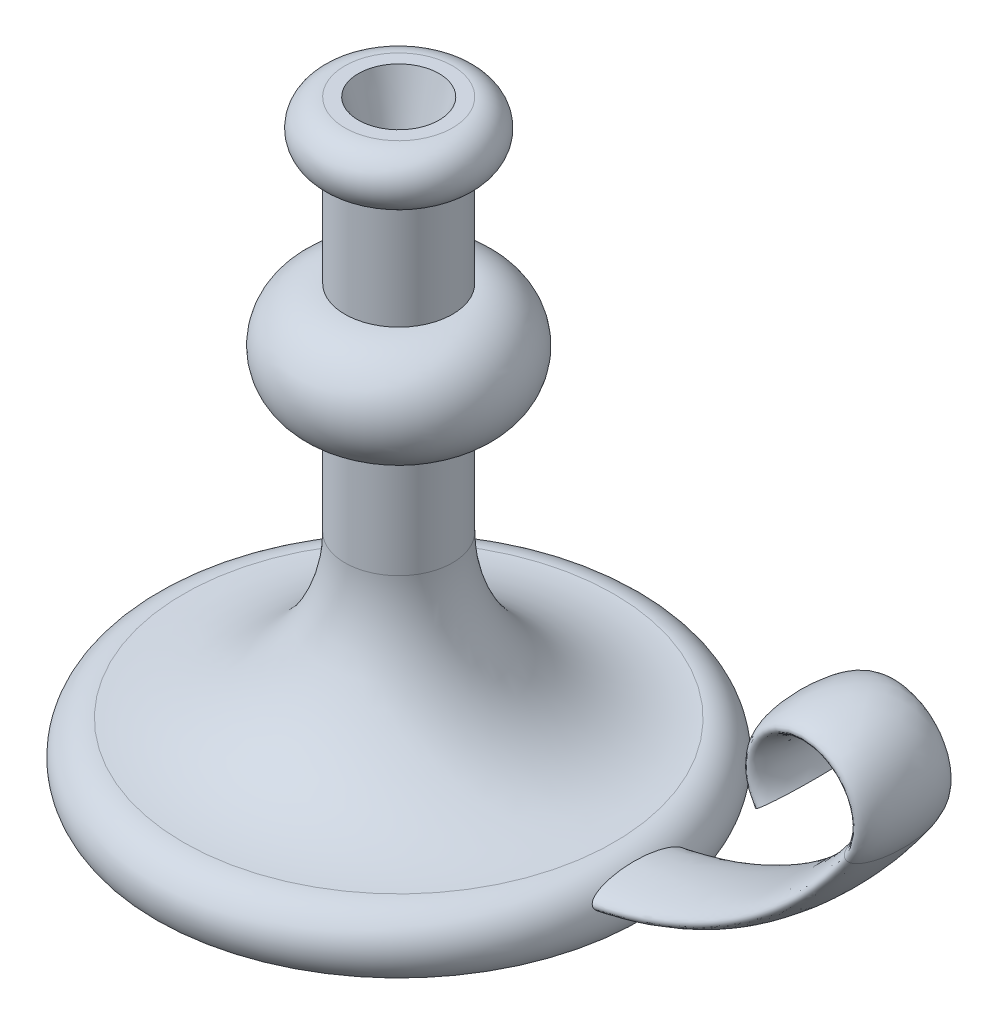
ISO-10303-21;
HEADER;
FILE_DESCRIPTION(('STEP AP214'),'2;1');
FILE_NAME('part.step','',(''),(''),'','','');
FILE_SCHEMA(('AUTOMOTIVE_DESIGN { 1 0 10303 214 1 1 1 1 }'));
ENDSEC;
DATA;
#1=APPLICATION_CONTEXT('core data for automotive mechanical design processes');
#2=APPLICATION_PROTOCOL_DEFINITION('international standard','automotive_design',2000,#1);
#3=PRODUCT_CONTEXT('',#1,'mechanical');
#4=PRODUCT('Part','Part','',(#3));
#5=PRODUCT_RELATED_PRODUCT_CATEGORY('part','',(#4));
#6=PRODUCT_DEFINITION_FORMATION('','',#4);
#7=PRODUCT_DEFINITION_CONTEXT('part definition',#1,'design');
#8=PRODUCT_DEFINITION('design','',#6,#7);
#9=PRODUCT_DEFINITION_SHAPE('','',#8);
#10=(LENGTH_UNIT() NAMED_UNIT(*) SI_UNIT(.MILLI.,.METRE.));
#11=(NAMED_UNIT(*) PLANE_ANGLE_UNIT() SI_UNIT($,.RADIAN.));
#12=(NAMED_UNIT(*) SI_UNIT($,.STERADIAN.) SOLID_ANGLE_UNIT());
#13=UNCERTAINTY_MEASURE_WITH_UNIT(LENGTH_MEASURE(1.E-05),#10,'distance_accuracy_value','');
#14=(GEOMETRIC_REPRESENTATION_CONTEXT(3) GLOBAL_UNCERTAINTY_ASSIGNED_CONTEXT((#13)) GLOBAL_UNIT_ASSIGNED_CONTEXT((#10,
#11,#12)) REPRESENTATION_CONTEXT('',''));
#15=CARTESIAN_POINT('',(0.,0.,0.));
#16=DIRECTION('',(0.,0.,1.));
#17=DIRECTION('',(1.,0.,0.));
#18=AXIS2_PLACEMENT_3D('',#15,#16,#17);
#19=CARTESIAN_POINT('',(0.,0.,0.));
#20=DIRECTION('',(0.,-1.,0.));
#21=DIRECTION('',(0.,0.,-1.));
#22=AXIS2_PLACEMENT_3D('',#19,#20,#21);
#23=PLANE('',#22);
#24=CARTESIAN_POINT('',(0.,0.,0.));
#25=DIRECTION('',(0.,-1.,0.));
#26=DIRECTION('',(0.,0.,-1.));
#27=AXIS2_PLACEMENT_3D('',#24,#25,#26);
#28=CIRCLE('',#27,90.);
#29=CARTESIAN_POINT('',(0.,0.,-90.));
#30=VERTEX_POINT('',#29);
#31=EDGE_CURVE('E69',#30,#30,#28,.T.);
#32=ORIENTED_EDGE('',*,*,#31,.T.);
#33=EDGE_LOOP('',(#32));
#34=FACE_BOUND('',#33,.T.);
#35=ADVANCED_FACE('F36',(#34),#23,.T.);
#36=CARTESIAN_POINT('',(0.,220.,0.));
#37=DIRECTION('',(0.,1.,0.));
#38=DIRECTION('',(0.,0.,1.));
#39=AXIS2_PLACEMENT_3D('',#36,#37,#38);
#40=PLANE('',#39);
#41=CARTESIAN_POINT('',(0.,220.,0.));
#42=DIRECTION('',(0.,1.,0.));
#43=DIRECTION('',(0.,0.,1.));
#44=AXIS2_PLACEMENT_3D('',#41,#42,#43);
#45=CIRCLE('',#44,15.);
#46=CARTESIAN_POINT('',(0.,220.,15.));
#47=VERTEX_POINT('',#46);
#48=EDGE_CURVE('E81',#47,#47,#45,.T.);
#49=ORIENTED_EDGE('',*,*,#48,.F.);
#50=EDGE_LOOP('',(#49));
#51=FACE_BOUND('',#50,.T.);
#52=CARTESIAN_POINT('',(0.,220.,0.));
#53=DIRECTION('',(0.,-1.,0.));
#54=DIRECTION('',(0.,0.,-1.));
#55=AXIS2_PLACEMENT_3D('',#52,#53,#54);
#56=CIRCLE('',#55,20.);
#57=CARTESIAN_POINT('',(0.,220.,-20.));
#58=VERTEX_POINT('',#57);
#59=EDGE_CURVE('E47',#58,#58,#56,.T.);
#60=ORIENTED_EDGE('',*,*,#59,.F.);
#61=EDGE_LOOP('',(#60));
#62=FACE_BOUND('',#61,.T.);
#63=ADVANCED_FACE('F87',(#51,#62),#40,.T.);
#64=CARTESIAN_POINT('',(0.,210.,0.));
#65=DIRECTION('',(0.,-1.,0.));
#66=DIRECTION('',(0.,0.,-1.));
#67=AXIS2_PLACEMENT_3D('',#64,#65,#66);
#68=TOROIDAL_SURFACE('',#67,20.,10.);
#69=ORIENTED_EDGE('',*,*,#59,.T.);
#70=EDGE_LOOP('',(#69));
#71=FACE_BOUND('',#70,.T.);
#72=CARTESIAN_POINT('',(0.,200.,0.));
#73=DIRECTION('',(0.,-1.,0.));
#74=DIRECTION('',(0.,0.,-1.));
#75=AXIS2_PLACEMENT_3D('',#72,#73,#74);
#76=CIRCLE('',#75,20.);
#77=CARTESIAN_POINT('',(0.,200.,-20.));
#78=VERTEX_POINT('',#77);
#79=EDGE_CURVE('E51',#78,#78,#76,.T.);
#80=ORIENTED_EDGE('',*,*,#79,.F.);
#81=EDGE_LOOP('',(#80));
#82=FACE_BOUND('',#81,.T.);
#83=ADVANCED_FACE('F90',(#71,#82),#68,.T.);
#84=CARTESIAN_POINT('',(0.,0.,0.));
#85=DIRECTION('',(0.,-1.,0.));
#86=DIRECTION('',(0.,0.,-1.));
#87=AXIS2_PLACEMENT_3D('',#84,#85,#86);
#88=CYLINDRICAL_SURFACE('',#87,20.);
#89=ORIENTED_EDGE('',*,*,#79,.T.);
#90=EDGE_LOOP('',(#89));
#91=FACE_BOUND('',#90,.T.);
#92=CARTESIAN_POINT('',(0.,160.,0.));
#93=DIRECTION('',(0.,-1.,0.));
#94=DIRECTION('',(0.,0.,-1.));
#95=AXIS2_PLACEMENT_3D('',#92,#93,#94);
#96=CIRCLE('',#95,20.);
#97=CARTESIAN_POINT('',(0.,160.,-20.));
#98=VERTEX_POINT('',#97);
#99=EDGE_CURVE('E55',#98,#98,#96,.T.);
#100=ORIENTED_EDGE('',*,*,#99,.F.);
#101=EDGE_LOOP('',(#100));
#102=FACE_BOUND('',#101,.T.);
#103=ADVANCED_FACE('F95',(#91,#102),#88,.T.);
#104=CARTESIAN_POINT('',(0.,140.,0.));
#105=DIRECTION('',(0.,-1.,0.));
#106=DIRECTION('',(0.,0.,-1.));
#107=AXIS2_PLACEMENT_3D('',#104,#105,#106);
#108=DEGENERATE_TOROIDAL_SURFACE('',#107,20.,20.,.T.);
#109=ORIENTED_EDGE('',*,*,#99,.T.);
#110=EDGE_LOOP('',(#109));
#111=FACE_BOUND('',#110,.T.);
#112=CARTESIAN_POINT('',(0.,120.,0.));
#113=DIRECTION('',(0.,-1.,0.));
#114=DIRECTION('',(0.,0.,-1.));
#115=AXIS2_PLACEMENT_3D('',#112,#113,#114);
#116=CIRCLE('',#115,20.);
#117=CARTESIAN_POINT('',(0.,120.,-20.));
#118=VERTEX_POINT('',#117);
#119=EDGE_CURVE('E60',#118,#118,#116,.T.);
#120=ORIENTED_EDGE('',*,*,#119,.F.);
#121=EDGE_LOOP('',(#120));
#122=FACE_BOUND('',#121,.T.);
#123=ADVANCED_FACE('F101',(#111,#122),#108,.T.);
#124=CARTESIAN_POINT('',(0.,0.,0.));
#125=DIRECTION('',(0.,-1.,0.));
#126=DIRECTION('',(0.,0.,-1.));
#127=AXIS2_PLACEMENT_3D('',#124,#125,#126);
#128=CYLINDRICAL_SURFACE('',#127,20.);
#129=ORIENTED_EDGE('',*,*,#119,.T.);
#130=EDGE_LOOP('',(#129));
#131=FACE_BOUND('',#130,.T.);
#132=CARTESIAN_POINT('',(0.,80.,0.));
#133=DIRECTION('',(0.,-1.,0.));
#134=DIRECTION('',(0.,0.,-1.));
#135=AXIS2_PLACEMENT_3D('',#132,#133,#134);
#136=CIRCLE('',#135,20.);
#137=CARTESIAN_POINT('',(0.,80.,-20.));
#138=VERTEX_POINT('',#137);
#139=EDGE_CURVE('E63',#138,#138,#136,.T.);
#140=ORIENTED_EDGE('',*,*,#139,.F.);
#141=EDGE_LOOP('',(#140));
#142=FACE_BOUND('',#141,.T.);
#143=ADVANCED_FACE('F105',(#131,#142),#128,.T.);
#144=CARTESIAN_POINT('',(0.,80.,0.));
#145=DIRECTION('',(0.,-1.,0.));
#146=DIRECTION('',(0.,0.,-1.));
#147=AXIS2_PLACEMENT_3D('',#144,#145,#146);
#148=TOROIDAL_SURFACE('',#147,80.,60.);
#149=ORIENTED_EDGE('',*,*,#139,.T.);
#150=EDGE_LOOP('',(#149));
#151=FACE_BOUND('',#150,.T.);
#152=CARTESIAN_POINT('',(0.,20.,0.));
#153=DIRECTION('',(0.,-1.,0.));
#154=DIRECTION('',(0.,0.,-1.));
#155=AXIS2_PLACEMENT_3D('',#152,#153,#154);
#156=CIRCLE('',#155,79.9999999999999);
#157=CARTESIAN_POINT('',(0.,20.,-79.9999999999999));
#158=VERTEX_POINT('',#157);
#159=EDGE_CURVE('E66',#158,#158,#156,.T.);
#160=ORIENTED_EDGE('',*,*,#159,.F.);
#161=EDGE_LOOP('',(#160));
#162=FACE_BOUND('',#161,.T.);
#163=ADVANCED_FACE('F109',(#151,#162),#148,.F.);
#164=CARTESIAN_POINT('',(0.,7.49999999999998,0.));
#165=DIRECTION('',(0.,-1.,0.));
#166=DIRECTION('',(0.,0.,-1.));
#167=AXIS2_PLACEMENT_3D('',#164,#165,#166);
#168=TOROIDAL_SURFACE('',#167,80.,12.5);
#169=CARTESIAN_POINT('',(89.5597422043341,12.9414346567555,-17.5));
#170=CARTESIAN_POINT('',(89.5390618403561,12.9834100865229,-17.4999996776707));
#171=CARTESIAN_POINT('',(89.5184817634659,13.0254349004937,-17.4978446678338));
#172=CARTESIAN_POINT('',(89.4776811982743,13.1092324497794,-17.4892861575811));
#173=CARTESIAN_POINT('',(89.457460843071,13.1510050881611,-17.4828811168849));
#174=CARTESIAN_POINT('',(89.3975402811209,13.2754779151414,-17.4575154450276));
#175=CARTESIAN_POINT('',(89.3585808220613,13.357332519418,-17.4324042670614));
#176=CARTESIAN_POINT('',(89.2734407804368,13.5379179993389,-17.3597430943198));
#177=CARTESIAN_POINT('',(89.2281116968574,13.6353152430682,-17.3079906529225));
#178=CARTESIAN_POINT('',(89.1421567137609,13.8217570109409,-17.1881654215547));
#179=CARTESIAN_POINT('',(89.10154096816,13.9107834263932,-17.1200583326704));
#180=CARTESIAN_POINT('',(89.0298799325304,14.0690063055582,-16.9825317839868));
#181=CARTESIAN_POINT('',(88.9982856031081,14.1392491335226,-16.9145677994464));
#182=CARTESIAN_POINT('',(88.9378435588022,14.2742914925202,-16.7722502997375));
#183=CARTESIAN_POINT('',(88.9089980734781,14.3390866000317,-16.6978916893925));
#184=CARTESIAN_POINT('',(88.8536099995593,14.4639626152392,-16.5442177801531));
#185=CARTESIAN_POINT('',(88.8270733532936,14.5240313225779,-16.4648905452804));
#186=CARTESIAN_POINT('',(88.7760376587063,14.6398576639347,-16.3025863942461));
#187=CARTESIAN_POINT('',(88.7515379613228,14.6956166708123,-16.2196106536441));
#188=CARTESIAN_POINT('',(88.7047328205489,14.8023169553036,-16.052427362784));
#189=CARTESIAN_POINT('',(88.6823939519366,14.8533308765833,-15.9682752160745));
#190=CARTESIAN_POINT('',(88.639155365759,14.9521540950118,-15.797741621076));
#191=CARTESIAN_POINT('',(88.6182558899721,14.9999628537458,-15.711359801597));
#192=CARTESIAN_POINT('',(88.5573681790008,15.1392585624723,-15.4492483073626));
#193=CARTESIAN_POINT('',(88.5192579811327,15.2264609786255,-15.2707999543232));
#194=CARTESIAN_POINT('',(88.4468979005836,15.3916731276291,-14.9088289385944));
#195=CARTESIAN_POINT('',(88.4126513155026,15.4696750103546,-14.7253021052891));
#196=CARTESIAN_POINT('',(88.3471391595039,15.6182965032923,-14.3538259785736));
#197=CARTESIAN_POINT('',(88.3158872528145,15.6888824046965,-14.1658608782527));
#198=CARTESIAN_POINT('',(88.2560127035516,15.8233792512431,-13.787400391854));
#199=CARTESIAN_POINT('',(88.2273872233002,15.8872974109117,-13.5969079973403));
#200=CARTESIAN_POINT('',(88.1723348827448,16.0094159388249,-13.2138496737791));
#201=CARTESIAN_POINT('',(88.1459074726896,16.06761773743,-13.0212842768931));
#202=CARTESIAN_POINT('',(88.0884248304702,16.1932687928886,-12.5849658119248));
#203=CARTESIAN_POINT('',(88.0579162002184,16.2592725226906,-12.3407253521735));
#204=CARTESIAN_POINT('',(87.9994625659013,16.3844358500305,-11.8501803460782));
#205=CARTESIAN_POINT('',(87.9715178234088,16.4435947494061,-11.6038755919223));
#206=CARTESIAN_POINT('',(87.9178897421857,16.5558889779776,-11.109529987048));
#207=CARTESIAN_POINT('',(87.8922075114269,16.6090213595568,-10.86148834924));
#208=CARTESIAN_POINT('',(87.8429155378603,16.7098546386226,-10.3640943607018));
#209=CARTESIAN_POINT('',(87.8193058942811,16.7575552760878,-10.1147419478211));
#210=CARTESIAN_POINT('',(87.7514718906047,16.8930622945828,-9.3663139664491));
#211=CARTESIAN_POINT('',(87.710111419914,16.97354616682,-8.86564202060326));
#212=CARTESIAN_POINT('',(87.6344118706353,17.1178657179368,-7.86153551840242));
#213=CARTESIAN_POINT('',(87.6000713341079,17.1817048544489,-7.35810155802579));
#214=CARTESIAN_POINT('',(87.5383679228554,17.2943697092707,-6.35225136111889));
#215=CARTESIAN_POINT('',(87.5109639050818,17.3432843238913,-5.84984753787572));
#216=CARTESIAN_POINT('',(87.4628391630611,17.4279603163538,-4.84354228831027));
#217=CARTESIAN_POINT('',(87.4421195253372,17.4637195559667,-4.33964063194106));
#218=CARTESIAN_POINT('',(87.4074386787954,17.5229738360404,-3.3308436388603));
#219=CARTESIAN_POINT('',(87.3934780874881,17.5464677559495,-2.82594821558698));
#220=CARTESIAN_POINT('',(87.3724154174235,17.5817273168609,-1.8161521338082));
#221=CARTESIAN_POINT('',(87.3653059747339,17.5935055508652,-1.31125206554538));
#222=CARTESIAN_POINT('',(87.3579750479624,17.6056484066489,-0.301318309133084));
#223=CARTESIAN_POINT('',(87.357752858235,17.6060141977103,0.203715360025915));
#224=CARTESIAN_POINT('',(87.3641963426438,17.5953454261039,1.21356726554151));
#225=CARTESIAN_POINT('',(87.3708612610896,17.5843121142069,1.71838551945491));
#226=CARTESIAN_POINT('',(87.3886163883338,17.554616306541,2.60695068649834));
#227=CARTESIAN_POINT('',(87.3982690399212,17.5384060734754,2.9908104647882));
#228=CARTESIAN_POINT('',(87.4214966880659,17.4990063104014,3.75807002785692));
#229=CARTESIAN_POINT('',(87.435071823598,17.4758165331044,4.14146979585408));
#230=CARTESIAN_POINT('',(87.4661109016121,17.4221255760208,4.90767543763189));
#231=CARTESIAN_POINT('',(87.4835755913648,17.3916229911934,5.29048118303739));
#232=CARTESIAN_POINT('',(87.5224765269599,17.3226675403927,6.05728766608015));
#233=CARTESIAN_POINT('',(87.5439339089184,17.2841722314846,6.4412835383542));
#234=CARTESIAN_POINT('',(87.5907685418077,17.1987228636429,7.20803081067535));
#235=CARTESIAN_POINT('',(87.6161451191905,17.1517702579396,7.59078241304208));
#236=CARTESIAN_POINT('',(87.6708875244928,17.0486132676473,8.35453102594092));
#237=CARTESIAN_POINT('',(87.7002509792864,16.9924143825779,8.73552894189113));
#238=CARTESIAN_POINT('',(87.7555693385741,16.8844873931685,9.40362807317323));
#239=CARTESIAN_POINT('',(87.780631862629,16.8349635590469,9.69115955865538));
#240=CARTESIAN_POINT('',(87.8333287645207,16.7293167465829,10.264824207122));
#241=CARTESIAN_POINT('',(87.8609635304671,16.6731927720485,10.550957152212));
#242=CARTESIAN_POINT('',(87.9190678138248,16.5534902310352,11.121711283161));
#243=CARTESIAN_POINT('',(87.9495404231883,16.4899035134826,11.4063304543322));
#244=CARTESIAN_POINT('',(88.0137266324375,16.3541216812727,11.9738772339474));
#245=CARTESIAN_POINT('',(88.0474477220507,16.2819065762202,12.2567992545896));
#246=CARTESIAN_POINT('',(88.1183718381952,16.1280994435204,12.8175821097586));
#247=CARTESIAN_POINT('',(88.1555499028382,16.0465737963571,13.095464192068));
#248=CARTESIAN_POINT('',(88.2343580118384,15.8719007074314,13.6468218234685));
#249=CARTESIAN_POINT('',(88.2759857295858,15.7787593350286,13.920299590218));
#250=CARTESIAN_POINT('',(88.3426568223938,15.628384040649,14.3254052817089));
#251=CARTESIAN_POINT('',(88.3655500017784,15.5765627213433,14.4594023169278));
#252=CARTESIAN_POINT('',(88.4129882653632,15.4688611687536,14.7254525655373));
#253=CARTESIAN_POINT('',(88.437533168995,15.4129813790937,14.8575059894884));
#254=CARTESIAN_POINT('',(88.4884967907571,15.2967269720351,15.1188747284341));
#255=CARTESIAN_POINT('',(88.5149109123158,15.2363633637367,15.2481958098577));
#256=CARTESIAN_POINT('',(88.5700241751771,15.1103179001213,15.5037035642079));
#257=CARTESIAN_POINT('',(88.5987227483177,15.044637367099,15.6298910063171));
#258=CARTESIAN_POINT('',(88.6570151826477,14.911317960161,15.8704199707057));
#259=CARTESIAN_POINT('',(88.686441736786,14.844056340729,15.9850095995258));
#260=CARTESIAN_POINT('',(88.7482816567767,14.7030103830828,16.209458139595));
#261=CARTESIAN_POINT('',(88.780697475614,14.6292206899982,16.3193130551167));
#262=CARTESIAN_POINT('',(88.8489097184971,14.4745639616532,16.5315146626622));
#263=CARTESIAN_POINT('',(88.8846785573507,14.3937550191612,16.6339121024915));
#264=CARTESIAN_POINT('',(88.9606113704152,14.2232561160768,16.8291907541921));
#265=CARTESIAN_POINT('',(89.0007675950253,14.1335818404866,16.9220882016581));
#266=CARTESIAN_POINT('',(89.0601235459872,14.0021924630806,17.0411637727683));
#267=CARTESIAN_POINT('',(89.0770574086404,13.9648250339928,17.0732949178268));
#268=CARTESIAN_POINT('',(89.1117704043088,13.8885105828124,17.1351129203987));
#269=CARTESIAN_POINT('',(89.1295494801997,13.8495636674963,17.1647999427301));
#270=CARTESIAN_POINT('',(89.1842722230346,13.7301865324199,17.249667258303));
#271=CARTESIAN_POINT('',(89.2225929343975,13.6472387371288,17.3006362954166));
#272=CARTESIAN_POINT('',(89.2830198855203,13.5177923286578,17.3659392171784));
#273=CARTESIAN_POINT('',(89.3038035106324,13.4734899832392,17.3859446551269));
#274=CARTESIAN_POINT('',(89.3462357272129,13.3835498526413,17.421521231844));
#275=CARTESIAN_POINT('',(89.3678838017235,13.3379128698459,17.4370949768747));
#276=CARTESIAN_POINT('',(89.4119048024239,13.2456714845449,17.4633118273198));
#277=CARTESIAN_POINT('',(89.4342765183815,13.1990687398025,17.4739627514632));
#278=CARTESIAN_POINT('',(89.4796070415905,13.1052444737538,17.490000362864));
#279=CARTESIAN_POINT('',(89.5025657624807,13.0580230439624,17.4953878199709));
#280=CARTESIAN_POINT('',(89.5464271716017,12.9684112208446,17.5004320668286));
#281=CARTESIAN_POINT('',(89.567293424565,12.9260327119427,17.5006298436875));
#282=CARTESIAN_POINT('',(89.6091580078856,12.8415284156485,17.496667300483));
#283=CARTESIAN_POINT('',(89.6301563797467,12.7994027167222,17.4925055351934));
#284=CARTESIAN_POINT('',(89.6721156351429,12.7157496198109,17.479965082583));
#285=CARTESIAN_POINT('',(89.6930765014328,12.6742224548789,17.4715847960013));
#286=CARTESIAN_POINT('',(89.7348115258833,12.5920532516239,17.4508625220261));
#287=CARTESIAN_POINT('',(89.755585576578,12.5514117057389,17.4385183877269));
#288=CARTESIAN_POINT('',(89.8013847331776,12.4623676182578,17.407062698976));
#289=CARTESIAN_POINT('',(89.8263321178973,12.414240205708,17.3870577635769));
#290=CARTESIAN_POINT('',(89.8756026524762,12.319894282953,17.3423007335128));
#291=CARTESIAN_POINT('',(89.8999253272691,12.2736772101065,17.317545140678));
#292=CARTESIAN_POINT('',(89.9718636752114,12.137971956704,17.2371059859825));
#293=CARTESIAN_POINT('',(90.0184026508767,12.0515209207991,17.1752845379974));
#294=CARTESIAN_POINT('',(90.1015176697337,11.8991704299988,17.0502729237445));
#295=CARTESIAN_POINT('',(90.1385373685484,11.8321383297491,16.9886971231215));
#296=CARTESIAN_POINT('',(90.2104869329278,11.7032426034953,16.8591573255864));
#297=CARTESIAN_POINT('',(90.2454151408798,11.6413830620091,16.7911883686368));
#298=CARTESIAN_POINT('',(90.3133841124364,11.5222099067344,16.6502911436159));
#299=CARTESIAN_POINT('',(90.3464212107124,11.4649050425002,16.5773538074552));
#300=CARTESIAN_POINT('',(90.4107258034173,11.3544143267813,16.4277349965842));
#301=CARTESIAN_POINT('',(90.4419937497577,11.3012274221164,16.351054487436));
#302=CARTESIAN_POINT('',(90.5066142435686,11.1922810586097,16.1853189525372));
#303=CARTESIAN_POINT('',(90.5397652495637,11.1369814833087,16.0958847835334));
#304=CARTESIAN_POINT('',(90.604304294124,11.0303194621559,15.9140859303208));
#305=CARTESIAN_POINT('',(90.6356921559874,10.9789574107341,15.8217209538339));
#306=CARTESIAN_POINT('',(90.6968383877969,10.8797698841652,15.6347974994417));
#307=CARTESIAN_POINT('',(90.7265992701635,10.8319389137699,15.5402427441424));
#308=CARTESIAN_POINT('',(90.784696934625,10.7393295137683,15.3492353522609));
#309=CARTESIAN_POINT('',(90.8130337948202,10.6945509167068,15.2527828201668));
#310=CARTESIAN_POINT('',(90.8771212205237,10.5940589597551,15.0277319837687));
#311=CARTESIAN_POINT('',(90.9124022819656,10.5393328792867,14.8985593440146));
#312=CARTESIAN_POINT('',(90.9809741103799,10.4339610325186,14.6380328432614));
#313=CARTESIAN_POINT('',(91.01426459514,10.3833158444319,14.5066786763353));
#314=CARTESIAN_POINT('',(91.1115171918211,10.2366440116079,14.1096810918787));
#315=CARTESIAN_POINT('',(91.1727828792964,10.1460018602116,13.8413800425925));
#316=CARTESIAN_POINT('',(91.2892862812458,9.97615455726937,13.2997906638467));
#317=CARTESIAN_POINT('',(91.3445203789085,9.89695625887061,13.0264994554544));
#318=CARTESIAN_POINT('',(91.4499805719978,9.7476965486629,12.4748594155958));
#319=CARTESIAN_POINT('',(91.500178044257,9.67768673078043,12.1964912536708));
#320=CARTESIAN_POINT('',(91.5957501918065,9.54592534416413,11.6372393425755));
#321=CARTESIAN_POINT('',(91.6411285723791,9.48416742117656,11.3563577087917));
#322=CARTESIAN_POINT('',(91.7275132616961,9.36779787162575,10.7925089006688));
#323=CARTESIAN_POINT('',(91.7685202729417,9.31318509647949,10.5095420692695));
#324=CARTESIAN_POINT('',(91.8503345045434,9.2052050871183,9.91387150213737));
#325=CARTESIAN_POINT('',(91.8907217744486,9.15249390095836,9.60099168323721));
#326=CARTESIAN_POINT('',(91.9669218199107,9.05389158705556,8.97359688182063));
#327=CARTESIAN_POINT('',(92.0027343661628,9.00800080116161,8.65908181816041));
#328=CARTESIAN_POINT('',(92.0700329889398,8.92240020575329,8.02865568808882));
#329=CARTESIAN_POINT('',(92.1015177516247,8.88269227276216,7.71274422766601));
#330=CARTESIAN_POINT('',(92.16033258385,8.80898713679325,7.07986626810726));
#331=CARTESIAN_POINT('',(92.1876625005417,8.77499014390519,6.76289973059518));
#332=CARTESIAN_POINT('',(92.2635030013649,8.68114273902115,5.81249868362365));
#333=CARTESIAN_POINT('',(92.3060517448551,8.62919999492206,5.17778747193996));
#334=CARTESIAN_POINT('',(92.3760091017523,8.54431318450701,3.9062793818699));
#335=CARTESIAN_POINT('',(92.4034169750228,8.51137004695198,3.2694824030546));
#336=CARTESIAN_POINT('',(92.4435085691827,8.46331702284125,1.99545741778631));
#337=CARTESIAN_POINT('',(92.4562084043365,8.44818761908851,1.35823064985613));
#338=CARTESIAN_POINT('',(92.4671302630246,8.43517103988552,0.0834423270836192));
#339=CARTESIAN_POINT('',(92.4653514271759,8.4372848879103,-0.554119245385175));
#340=CARTESIAN_POINT('',(92.4472853754493,8.45883344750913,-1.82886328296684));
#341=CARTESIAN_POINT('',(92.4309954438925,8.47827140120316,-2.46604565477789));
#342=CARTESIAN_POINT('',(92.3836590626411,8.53514174464775,-3.73902583866684));
#343=CARTESIAN_POINT('',(92.3526140808134,8.57257234445198,-4.37482378215177));
#344=CARTESIAN_POINT('',(92.2921790866406,8.64621329194969,-5.36625544460653));
#345=CARTESIAN_POINT('',(92.268011823561,8.67578736963451,-5.72271555901548));
#346=CARTESIAN_POINT('',(92.2147013952357,8.74146404735358,-6.43465819602994));
#347=CARTESIAN_POINT('',(92.1855583836335,8.77756644580505,-6.79014074847682));
#348=CARTESIAN_POINT('',(92.1221127048895,8.85679311513315,-7.49983836059199));
#349=CARTESIAN_POINT('',(92.0878103957551,8.89991689880787,-7.85405350646189));
#350=CARTESIAN_POINT('',(92.0137981226252,8.99384143269611,-8.56089767223658));
#351=CARTESIAN_POINT('',(91.974088334396,9.04464193338941,-8.91352674331089));
#352=CARTESIAN_POINT('',(91.9015818240066,9.13842562293677,-9.51226790232876));
#353=CARTESIAN_POINT('',(91.8702370654074,9.17924629619395,-9.75889575933969));
#354=CARTESIAN_POINT('',(91.804562492006,9.26550036635871,-10.250941962028));
#355=CARTESIAN_POINT('',(91.7702327567072,9.31093364041727,-10.4963603397355));
#356=CARTESIAN_POINT('',(91.6984266463274,9.40685898724839,-10.9855805665716));
#357=CARTESIAN_POINT('',(91.6609523533819,9.45734771681924,-11.2293833718148));
#358=CARTESIAN_POINT('',(91.5826038967895,9.56401317098983,-11.715177562103));
#359=CARTESIAN_POINT('',(91.5417298772538,9.62018965451271,-11.9571690234558));
#360=CARTESIAN_POINT('',(91.4386423376748,9.7635121099634,-12.5384162018468));
#361=CARTESIAN_POINT('',(91.3745858903291,9.85386844470704,-12.8765786557757));
#362=CARTESIAN_POINT('',(91.2720163238269,10.0014015523802,-13.3793136041298));
#363=CARTESIAN_POINT('',(91.2367090969995,10.0526332971689,-13.5462966134994));
#364=CARTESIAN_POINT('',(91.1637294936459,10.1596261841614,-13.8782853379543));
#365=CARTESIAN_POINT('',(91.1260572231724,10.2153871233015,-14.0432911413062));
#366=CARTESIAN_POINT('',(91.0448513754,10.3369382727864,-14.3844416693118));
#367=CARTESIAN_POINT('',(91.0010908407918,10.4031767890594,-14.5603739146104));
#368=CARTESIAN_POINT('',(90.9100440331648,10.5428509324194,-14.9085311659821));
#369=CARTESIAN_POINT('',(90.8627565865348,10.6162889577859,-15.0807549132305));
#370=CARTESIAN_POINT('',(90.7642492199856,10.7715651970477,-15.4195496037295));
#371=CARTESIAN_POINT('',(90.7130423069868,10.8533759065564,-15.5861368065577));
#372=CARTESIAN_POINT('',(90.6058220172115,11.0275348916426,-15.9120386126942));
#373=CARTESIAN_POINT('',(90.5498128203454,11.1198740259077,-16.0713593593317));
#374=CARTESIAN_POINT('',(90.4444082893053,11.2969255920337,-16.3465910082035));
#375=CARTESIAN_POINT('',(90.3961277047706,11.3791055101421,-16.4645448336184));
#376=CARTESIAN_POINT('',(90.2950977924849,11.5538633486863,-16.6911566146547));
#377=CARTESIAN_POINT('',(90.2423390562533,11.646463301195,-16.7997939840163));
#378=CARTESIAN_POINT('',(90.1590440243458,11.795301420027,-16.9524870890683));
#379=CARTESIAN_POINT('',(90.1303607600849,11.8469859215394,-17.0019977189778));
#380=CARTESIAN_POINT('',(90.0716181087376,11.9538274561507,-17.0963102611096));
#381=CARTESIAN_POINT('',(90.0415584049396,12.0089852895521,-17.1411110817337));
#382=CARTESIAN_POINT('',(89.9801756575597,12.1227246632087,-17.2246441347396));
#383=CARTESIAN_POINT('',(89.9488577537652,12.1812926416246,-17.263398415537));
#384=CARTESIAN_POINT('',(89.884954967133,12.3020144005059,-17.3335784406429));
#385=CARTESIAN_POINT('',(89.8523712452275,12.3641649194652,-17.3650107233703));
#386=CARTESIAN_POINT('',(89.7981176909035,12.4687258013533,-17.4092508881814));
#387=CARTESIAN_POINT('',(89.7767436177656,12.5101841078543,-17.4246893204627));
#388=CARTESIAN_POINT('',(89.7336969050675,12.5942336377176,-17.4515182330192));
#389=CARTESIAN_POINT('',(89.7120243813913,12.6368244270177,-17.4629102408532));
#390=CARTESIAN_POINT('',(89.6685521390583,12.722820753129,-17.4812886417918));
#391=CARTESIAN_POINT('',(89.6467526103346,12.7662252198269,-17.488280453409));
#392=CARTESIAN_POINT('',(89.6031794397246,12.8535466229687,-17.4976362320133));
#393=CARTESIAN_POINT('',(89.5814057970823,12.8974635440191,-17.5000003376542));
#394=CARTESIAN_POINT('',(89.5597422043341,12.9414346567555,-17.5));
#395=B_SPLINE_CURVE_WITH_KNOTS('',3,(#169,#170,#171,#172,#173,#174,#175,#176,#177,#178,#179,
#180,#181,#182,#183,#184,#185,#186,#187,#188,#189,#190,#191,#192,#193,#194,#195,#196,#197,#198,
#199,#200,#201,#202,#203,#204,#205,#206,#207,#208,#209,#210,#211,#212,#213,#214,#215,#216,#217,
#218,#219,#220,#221,#222,#223,#224,#225,#226,#227,#228,#229,#230,#231,#232,#233,#234,#235,#236,
#237,#238,#239,#240,#241,#242,#243,#244,#245,#246,#247,#248,#249,#250,#251,#252,#253,#254,#255,
#256,#257,#258,#259,#260,#261,#262,#263,#264,#265,#266,#267,#268,#269,#270,#271,#272,#273,#274,
#275,#276,#277,#278,#279,#280,#281,#282,#283,#284,#285,#286,#287,#288,#289,#290,#291,#292,#293,
#294,#295,#296,#297,#298,#299,#300,#301,#302,#303,#304,#305,#306,#307,#308,#309,#310,#311,#312,
#313,#314,#315,#316,#317,#318,#319,#320,#321,#322,#323,#324,#325,#326,#327,#328,#329,#330,#331,
#332,#333,#334,#335,#336,#337,#338,#339,#340,#341,#342,#343,#344,#345,#346,#347,#348,#349,#350,
#351,#352,#353,#354,#355,#356,#357,#358,#359,#360,#361,#362,#363,#364,#365,#366,#367,#368,#369,
#370,#371,#372,#373,#374,#375,#376,#377,#378,#379,#380,#381,#382,#383,#384,#385,#386,#387,#388,
#389,#390,#391,#392,#393,#394),.UNSPECIFIED.,.T.,.F.,(4,2,2,2,2,2,2,2,2,2,2,2,2,2,2,2,2,2,2,2,2,
2,2,2,2,2,2,2,2,2,2,2,2,2,2,2,2,2,2,2,2,2,2,2,2,2,2,2,2,2,2,2,2,2,2,2,2,2,2,2,2,2,2,2,2,2,2,2,2,
2,2,2,2,2,2,2,2,2,2,2,2,2,2,2,2,2,2,2,2,2,2,2,2,2,2,2,2,2,2,2,2,2,2,2,2,2,2,2,2,2,2,2,4),(0.,
0.140326879649328,0.280704643844316,0.561461806499956,0.917225717585805,1.27374235386084,
1.58146302398145,1.8894311959364,2.19816989275473,2.50680983170023,2.80944292372746,
3.11212672643253,3.71838915770189,4.32516518168242,4.93458970782538,5.5433478409353,
6.1519532590664,6.91631911029037,7.68076285707077,8.44557890144715,9.21043154271118,
10.7363530227226,12.2619572680849,13.7782885580522,15.2948661984781,16.81158236824,
18.3266664767783,19.8415953542034,21.3563580231466,22.5092504482306,23.6621837256806,
24.8153386988896,25.9747813799628,27.1340250219352,28.2925816429422,29.1710242088836,
30.0495995331111,30.9291435591539,31.8107663507031,32.6864555684204,33.5616891298972,
33.9980703124474,34.43440386654,34.8696994156043,35.3048870393027,35.712948546561,
36.121347939735,36.5266413619582,36.9312301321627,37.0874810726009,37.2437214677036,
37.5562829439447,37.7147148343189,37.8730533580125,38.0311395270881,38.189202570574,
38.3307149014327,38.4722741597122,38.613887124224,38.755576919115,38.9286541005771,
39.101859220718,39.4485901352338,39.7429975955384,40.0376353818189,40.3328261359405,
40.6279411430419,40.9585479808932,41.2891878931725,41.6193018978012,41.9493977775685,
42.3832551508594,42.8171738887963,43.685946791876,44.5552378220692,45.4292182663351,
46.3025217875267,47.1756847521797,48.1351081860317,49.0945796914506,50.0543418354844,
51.0141392787915,52.9283366635991,54.8426276125062,56.7548192562788,58.6671243992137,
60.5797874956836,62.4922603557666,63.567681932182,64.6430703071848,65.7183840946003,
66.7936629380602,67.5494303160582,68.3051775707172,69.0604283053759,69.8156470419337,
70.8826765887338,71.4172057561786,71.9517109715317,72.5305894861716,73.1096614946424,
73.6868888443985,74.2636187787005,74.7180950553369,75.1735510009083,75.4046853668796,
75.6358731855891,75.8661972266861,76.0963147970914,76.2435550398531,76.39073963898,
76.5377426347988,76.6847412260986),.UNSPECIFIED.);
#396=CARTESIAN_POINT('',(89.5597422043341,12.9414346567555,-17.5));
#397=VERTEX_POINT('',#396);
#398=EDGE_CURVE('E10',#397,#397,#395,.T.);
#399=ORIENTED_EDGE('',*,*,#398,.F.);
#400=EDGE_LOOP('',(#399));
#401=FACE_BOUND('',#400,.T.);
#402=ORIENTED_EDGE('',*,*,#159,.T.);
#403=EDGE_LOOP('',(#402));
#404=FACE_BOUND('',#403,.T.);
#405=ORIENTED_EDGE('',*,*,#31,.F.);
#406=EDGE_LOOP('',(#405));
#407=FACE_BOUND('',#406,.T.);
#408=ADVANCED_FACE('F112',(#401,#404,#407),#168,.T.);
#409=CARTESIAN_POINT('',(150.634185358261,75.,0.));
#410=DIRECTION('',(0.566666666666666,-0.823947139620552,0.));
#411=DIRECTION('',(0.,0.,-1.));
#412=AXIS2_PLACEMENT_3D('',#409,#410,#411);
#413=PLANE('',#412);
#414=CARTESIAN_POINT('',(150.634185358261,75.,0.));
#415=DIRECTION('',(0.566666666666666,-0.823947139620552,0.));
#416=DIRECTION('',(0.,0.,-1.));
#417=AXIS2_PLACEMENT_3D('',#414,#415,#416);
#418=ELLIPSE('',#417,17.5,5.);
#419=CARTESIAN_POINT('',(150.634185358261,75.,-17.5));
#420=VERTEX_POINT('',#419);
#421=EDGE_CURVE('E72',#420,#420,#418,.T.);
#422=ORIENTED_EDGE('',*,*,#421,.T.);
#423=EDGE_LOOP('',(#422));
#424=FACE_BOUND('',#423,.T.);
#425=ADVANCED_FACE('F117',(#424),#413,.T.);
#426=CARTESIAN_POINT('',(60.,10.,-17.5));
#427=CARTESIAN_POINT('',(110.410191303973,10.,-17.5));
#428=CARTESIAN_POINT('',(155.026295870831,33.4646670673665,-17.5));
#429=CARTESIAN_POINT('',(183.592070943083,75.,-17.5));
#430=CARTESIAN_POINT('',(60.,20.,-17.5));
#431=CARTESIAN_POINT('',(107.049511883708,20.,-17.5));
#432=CARTESIAN_POINT('',(148.691209479443,41.9003559295421,-17.5));
#433=CARTESIAN_POINT('',(175.352599546877,80.6666666666666,-17.5));
#434=CARTESIAN_POINT('',(60.,20.,17.5));
#435=CARTESIAN_POINT('',(107.049511883708,20.,17.5));
#436=CARTESIAN_POINT('',(148.691209479443,41.9003559295421,17.5));
#437=CARTESIAN_POINT('',(175.352599546877,80.6666666666666,17.5));
#438=CARTESIAN_POINT('',(60.,10.,17.5));
#439=CARTESIAN_POINT('',(110.410191303973,10.,17.5));
#440=CARTESIAN_POINT('',(155.026295870831,33.4646670673665,17.5));
#441=CARTESIAN_POINT('',(183.592070943083,75.,17.5));
#442=CARTESIAN_POINT('',(60.,0.,17.5));
#443=CARTESIAN_POINT('',(113.770870724238,0.,17.5));
#444=CARTESIAN_POINT('',(161.36138226222,25.0289782051909,17.5));
#445=CARTESIAN_POINT('',(191.831542339288,69.3333333333333,17.5));
#446=CARTESIAN_POINT('',(60.,0.,-17.5));
#447=CARTESIAN_POINT('',(113.770870724238,0.,-17.5));
#448=CARTESIAN_POINT('',(161.36138226222,25.0289782051909,-17.5));
#449=CARTESIAN_POINT('',(191.831542339288,69.3333333333333,-17.5));
#450=CARTESIAN_POINT('',(60.,10.,-17.5));
#451=CARTESIAN_POINT('',(110.410191303973,10.,-17.5));
#452=CARTESIAN_POINT('',(155.026295870831,33.4646670673665,-17.5));
#453=CARTESIAN_POINT('',(183.592070943083,75.,-17.5));
#454=(BOUNDED_SURFACE() B_SPLINE_SURFACE(3,3,((#426,#427,#428,#429),(#430,#431,#432,#433),(#434,
#435,#436,#437),(#438,#439,#440,#441),(#442,#443,#444,#445),(#446,#447,#448,#449),(#450,#451,
#452,#453)),.UNSPECIFIED.,.T.,.F.,.F.) B_SPLINE_SURFACE_WITH_KNOTS((4,3,4),(4,4),(0.,0.5,1.),
(0.,1.),.UNSPECIFIED.) GEOMETRIC_REPRESENTATION_ITEM() RATIONAL_B_SPLINE_SURFACE(((1.,
0.923374135437856,0.923374135437856,1.),(0.333333333333333,0.307791378479285,0.307791378479285,
0.333333333333333),(0.333333333333333,0.307791378479285,0.307791378479285,0.333333333333333),
(1.,0.923374135437856,0.923374135437856,1.),(0.333333333333333,0.307791378479285,
0.307791378479285,0.333333333333333),(0.333333333333333,0.307791378479285,0.307791378479285,
0.333333333333333),(1.,0.923374135437856,0.923374135437856,1.))) REPRESENTATION_ITEM('') SURFACE());
#455=CARTESIAN_POINT('',(183.592070943083,75.,0.));
#456=DIRECTION('',(0.566666666666667,0.823947139620552,0.));
#457=DIRECTION('',(0.,0.,-1.));
#458=AXIS2_PLACEMENT_3D('',#455,#456,#457);
#459=ELLIPSE('',#458,17.5,5.);
#460=CARTESIAN_POINT('',(183.592070943083,75.,-17.5));
#461=VERTEX_POINT('',#460);
#462=EDGE_CURVE('E75',#461,#461,#459,.T.);
#463=ORIENTED_EDGE('',*,*,#398,.T.);
#464=EDGE_LOOP('',(#463));
#465=FACE_BOUND('',#464,.T.);
#466=ORIENTED_EDGE('',*,*,#462,.F.);
#467=EDGE_LOOP('',(#466));
#468=FACE_BOUND('',#467,.T.);
#469=ADVANCED_FACE('F122',(#465,#468),#454,.T.);
#470=CARTESIAN_POINT('',(183.592070943083,75.,-17.5));
#471=CARTESIAN_POINT('',(193.981461744242,90.10642735238,-17.5));
#472=CARTESIAN_POINT('',(185.447347211541,106.333333333333,-17.5));
#473=CARTESIAN_POINT('',(167.113128150672,106.333333333333,-17.5));
#474=CARTESIAN_POINT('',(148.778909089802,106.333333333333,-17.5));
#475=CARTESIAN_POINT('',(140.244794557101,90.1064273523801,-17.5));
#476=CARTESIAN_POINT('',(150.634185358261,75.,-17.5));
#477=CARTESIAN_POINT('',(175.352599546877,80.6666666666667,-17.5));
#478=CARTESIAN_POINT('',(180.547294947457,88.2198803428567,-17.5));
#479=CARTESIAN_POINT('',(176.280237681107,96.3333333333333,-17.5));
#480=CARTESIAN_POINT('',(167.113128150672,96.3333333333333,-17.5));
#481=CARTESIAN_POINT('',(157.946018620237,96.3333333333333,-17.5));
#482=CARTESIAN_POINT('',(153.678961353887,88.2198803428567,-17.5));
#483=CARTESIAN_POINT('',(158.873656754466,80.6666666666667,-17.5));
#484=CARTESIAN_POINT('',(175.352599546877,80.6666666666667,17.5));
#485=CARTESIAN_POINT('',(180.547294947457,88.2198803428567,17.5));
#486=CARTESIAN_POINT('',(176.280237681107,96.3333333333333,17.5));
#487=CARTESIAN_POINT('',(167.113128150672,96.3333333333333,17.5));
#488=CARTESIAN_POINT('',(157.946018620237,96.3333333333333,17.5));
#489=CARTESIAN_POINT('',(153.678961353887,88.2198803428567,17.5));
#490=CARTESIAN_POINT('',(158.873656754466,80.6666666666667,17.5));
#491=CARTESIAN_POINT('',(183.592070943083,75.,17.5));
#492=CARTESIAN_POINT('',(193.981461744242,90.10642735238,17.5));
#493=CARTESIAN_POINT('',(185.447347211541,106.333333333333,17.5));
#494=CARTESIAN_POINT('',(167.113128150672,106.333333333333,17.5));
#495=CARTESIAN_POINT('',(148.778909089802,106.333333333333,17.5));
#496=CARTESIAN_POINT('',(140.244794557101,90.1064273523801,17.5));
#497=CARTESIAN_POINT('',(150.634185358261,75.,17.5));
#498=CARTESIAN_POINT('',(191.831542339288,69.3333333333333,17.5));
#499=CARTESIAN_POINT('',(207.415628541028,91.9929743619034,17.5));
#500=CARTESIAN_POINT('',(194.614456741976,116.333333333333,17.5));
#501=CARTESIAN_POINT('',(167.113128150672,116.333333333333,17.5));
#502=CARTESIAN_POINT('',(139.611799559367,116.333333333333,17.5));
#503=CARTESIAN_POINT('',(126.810627760316,91.9929743619035,17.5));
#504=CARTESIAN_POINT('',(142.394713962055,69.3333333333334,17.5));
#505=CARTESIAN_POINT('',(191.831542339288,69.3333333333333,-17.5));
#506=CARTESIAN_POINT('',(207.415628541028,91.9929743619034,-17.5));
#507=CARTESIAN_POINT('',(194.614456741976,116.333333333333,-17.5));
#508=CARTESIAN_POINT('',(167.113128150672,116.333333333333,-17.5));
#509=CARTESIAN_POINT('',(139.611799559367,116.333333333333,-17.5));
#510=CARTESIAN_POINT('',(126.810627760316,91.9929743619035,-17.5));
#511=CARTESIAN_POINT('',(142.394713962055,69.3333333333334,-17.5));
#512=CARTESIAN_POINT('',(183.592070943083,75.,-17.5));
#513=CARTESIAN_POINT('',(193.981461744242,90.10642735238,-17.5));
#514=CARTESIAN_POINT('',(185.447347211541,106.333333333333,-17.5));
#515=CARTESIAN_POINT('',(167.113128150672,106.333333333333,-17.5));
#516=CARTESIAN_POINT('',(148.778909089802,106.333333333333,-17.5));
#517=CARTESIAN_POINT('',(140.244794557101,90.1064273523801,-17.5));
#518=CARTESIAN_POINT('',(150.634185358261,75.,-17.5));
#519=(BOUNDED_SURFACE() B_SPLINE_SURFACE(3,3,((#470,#471,#472,#473,#474,#475,#476),(#477,#478,
#479,#480,#481,#482,#483),(#484,#485,#486,#487,#488,#489,#490),(#491,#492,#493,#494,#495,#496,
#497),(#498,#499,#500,#501,#502,#503,#504),(#505,#506,#507,#508,#509,#510,#511),(#512,#513,#514,
#515,#516,#517,#518)),.UNSPECIFIED.,.T.,.F.,.F.) B_SPLINE_SURFACE_WITH_KNOTS((4,3,4),(4,3,4),
(0.,0.5,1.),(0.,0.5,1.),
.UNSPECIFIED.) GEOMETRIC_REPRESENTATION_ITEM() RATIONAL_B_SPLINE_SURFACE(((1.,0.643649778750421,
0.643649778750421,1.,0.643649778750421,0.643649778750421,1.),(0.333333333333333,
0.21454992625014,0.21454992625014,0.333333333333333,0.21454992625014,0.21454992625014,
0.333333333333333),(0.333333333333333,0.21454992625014,0.21454992625014,0.333333333333333,
0.21454992625014,0.21454992625014,0.333333333333333),(1.,0.643649778750421,0.643649778750421,1.,
0.643649778750421,0.643649778750421,1.),(0.333333333333333,0.21454992625014,0.21454992625014,
0.333333333333333,0.21454992625014,0.21454992625014,0.333333333333333),(0.333333333333333,
0.21454992625014,0.21454992625014,0.333333333333333,0.21454992625014,0.21454992625014,
0.333333333333333),(1.,0.643649778750421,0.643649778750421,1.,0.643649778750421,
0.643649778750421,1.))) REPRESENTATION_ITEM('') SURFACE());
#520=ORIENTED_EDGE('',*,*,#421,.F.);
#521=EDGE_LOOP('',(#520));
#522=FACE_BOUND('',#521,.T.);
#523=ORIENTED_EDGE('',*,*,#462,.T.);
#524=EDGE_LOOP('',(#523));
#525=FACE_BOUND('',#524,.T.);
#526=ADVANCED_FACE('F119',(#522,#525),#519,.T.);
#527=CARTESIAN_POINT('',(0.,220.,0.));
#528=DIRECTION('',(0.,1.,0.));
#529=DIRECTION('',(0.,0.,1.));
#530=AXIS2_PLACEMENT_3D('',#527,#528,#529);
#531=CONICAL_SURFACE('',#530,15.,0.26179938779915);
#532=CARTESIAN_POINT('',(0.,195.,0.));
#533=DIRECTION('',(0.,1.,0.));
#534=DIRECTION('',(0.,0.,1.));
#535=AXIS2_PLACEMENT_3D('',#532,#533,#534);
#536=CIRCLE('',#535,8.30127018922192);
#537=CARTESIAN_POINT('',(0.,195.,8.30127018922192));
#538=VERTEX_POINT('',#537);
#539=EDGE_CURVE('E78',#538,#538,#536,.T.);
#540=ORIENTED_EDGE('',*,*,#539,.F.);
#541=EDGE_LOOP('',(#540));
#542=FACE_BOUND('',#541,.T.);
#543=ORIENTED_EDGE('',*,*,#48,.T.);
#544=EDGE_LOOP('',(#543));
#545=FACE_BOUND('',#544,.T.);
#546=ADVANCED_FACE('F85',(#542,#545),#531,.F.);
#547=CARTESIAN_POINT('',(0.,195.,0.));
#548=DIRECTION('',(0.,1.,0.));
#549=DIRECTION('',(0.,0.,1.));
#550=AXIS2_PLACEMENT_3D('',#547,#548,#549);
#551=PLANE('',#550);
#552=ORIENTED_EDGE('',*,*,#539,.T.);
#553=EDGE_LOOP('',(#552));
#554=FACE_BOUND('',#553,.T.);
#555=ADVANCED_FACE('F145',(#554),#551,.T.);
#556=CLOSED_SHELL('',(#35,#63,#83,#103,#123,#143,#163,#408,#425,#469,#526,#546,#555));
#557=MANIFOLD_SOLID_BREP('B2',#556);
#558=ADVANCED_BREP_SHAPE_REPRESENTATION('',(#18,#557),#14);
#559=SHAPE_DEFINITION_REPRESENTATION(#9,#558);
ENDSEC;
END-ISO-10303-21;
